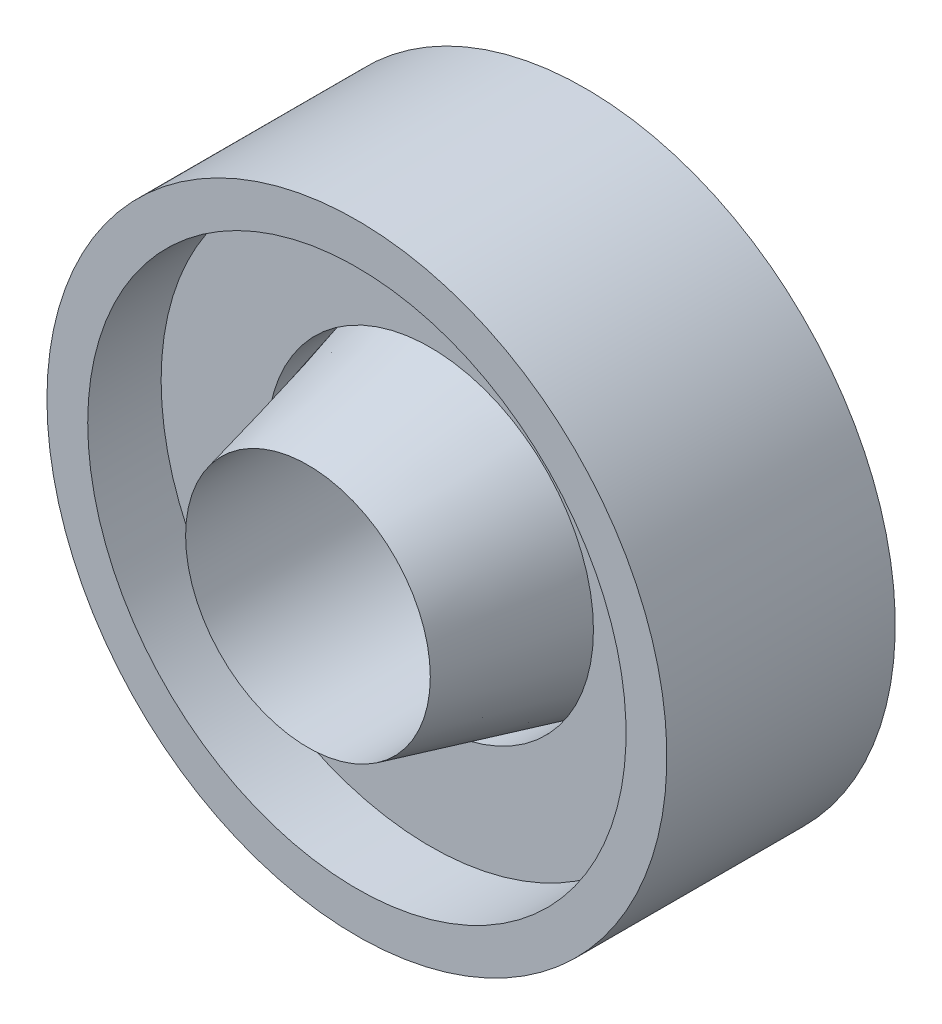
ISO-10303-21;
HEADER;
FILE_DESCRIPTION(('STEP AP214'),'2;1');
FILE_NAME('part.step','',(''),(''),'','','');
FILE_SCHEMA(('AUTOMOTIVE_DESIGN { 1 0 10303 214 1 1 1 1 }'));
ENDSEC;
DATA;
#1=APPLICATION_CONTEXT('core data for automotive mechanical design processes');
#2=APPLICATION_PROTOCOL_DEFINITION('international standard','automotive_design',2000,#1);
#3=PRODUCT_CONTEXT('',#1,'mechanical');
#4=PRODUCT('Part','Part','',(#3));
#5=PRODUCT_RELATED_PRODUCT_CATEGORY('part','',(#4));
#6=PRODUCT_DEFINITION_FORMATION('','',#4);
#7=PRODUCT_DEFINITION_CONTEXT('part definition',#1,'design');
#8=PRODUCT_DEFINITION('design','',#6,#7);
#9=PRODUCT_DEFINITION_SHAPE('','',#8);
#10=(LENGTH_UNIT() NAMED_UNIT(*) SI_UNIT(.MILLI.,.METRE.));
#11=(NAMED_UNIT(*) PLANE_ANGLE_UNIT() SI_UNIT($,.RADIAN.));
#12=(NAMED_UNIT(*) SI_UNIT($,.STERADIAN.) SOLID_ANGLE_UNIT());
#13=UNCERTAINTY_MEASURE_WITH_UNIT(LENGTH_MEASURE(1.E-05),#10,'distance_accuracy_value','');
#14=(GEOMETRIC_REPRESENTATION_CONTEXT(3) GLOBAL_UNCERTAINTY_ASSIGNED_CONTEXT((#13)) GLOBAL_UNIT_ASSIGNED_CONTEXT((#10,
#11,#12)) REPRESENTATION_CONTEXT('',''));
#15=CARTESIAN_POINT('',(0.,0.,0.));
#16=DIRECTION('',(0.,0.,1.));
#17=DIRECTION('',(1.,0.,0.));
#18=AXIS2_PLACEMENT_3D('',#15,#16,#17);
#19=CARTESIAN_POINT('',(0.,0.,4.99999999999965));
#20=DIRECTION('',(0.,0.,0.999999999999994));
#21=DIRECTION('',(0.999999999999998,0.,0.));
#22=AXIS2_PLACEMENT_3D('',#19,#20,#21);
#23=PLANE('',#22);
#24=CARTESIAN_POINT('',(0.,0.,4.99999999999965));
#25=DIRECTION('',(0.,0.,0.999999999999994));
#26=DIRECTION('',(0.999999999999998,0.,0.));
#27=AXIS2_PLACEMENT_3D('',#24,#25,#26);
#28=CIRCLE('',#27,20.);
#29=CARTESIAN_POINT('',(-20.,0.,4.99999999999965));
#30=VERTEX_POINT('',#29);
#31=EDGE_CURVE('E56',#30,#30,#28,.T.);
#32=ORIENTED_EDGE('',*,*,#31,.F.);
#33=EDGE_LOOP('',(#32));
#34=FACE_BOUND('',#33,.T.);
#35=CARTESIAN_POINT('',(0.,0.,4.99999999999965));
#36=DIRECTION('',(0.,0.,0.999999999999994));
#37=DIRECTION('',(0.999999999999998,0.,0.));
#38=AXIS2_PLACEMENT_3D('',#35,#36,#37);
#39=CIRCLE('',#38,33.);
#40=CARTESIAN_POINT('',(-33.,0.,4.99999999999965));
#41=VERTEX_POINT('',#40);
#42=EDGE_CURVE('E12',#41,#41,#39,.F.);
#43=ORIENTED_EDGE('',*,*,#42,.F.);
#44=EDGE_LOOP('',(#43));
#45=FACE_BOUND('',#44,.T.);
#46=ADVANCED_FACE('F48',(#34,#45),#23,.T.);
#47=CARTESIAN_POINT('',(0.,0.,-5.));
#48=DIRECTION('',(0.,0.,0.999999999999994));
#49=DIRECTION('',(0.999999999999998,0.,0.));
#50=AXIS2_PLACEMENT_3D('',#47,#48,#49);
#51=PLANE('',#50);
#52=CARTESIAN_POINT('',(0.,0.,-5.));
#53=DIRECTION('',(0.,0.,0.999999999999994));
#54=DIRECTION('',(0.999999999999998,0.,0.));
#55=AXIS2_PLACEMENT_3D('',#52,#53,#54);
#56=CIRCLE('',#55,20.);
#57=CARTESIAN_POINT('',(-20.,0.,-5.));
#58=VERTEX_POINT('',#57);
#59=EDGE_CURVE('E61',#58,#58,#56,.T.);
#60=ORIENTED_EDGE('',*,*,#59,.T.);
#61=EDGE_LOOP('',(#60));
#62=FACE_BOUND('',#61,.T.);
#63=CARTESIAN_POINT('',(0.,0.,-5.));
#64=DIRECTION('',(0.,0.,0.999999999999994));
#65=DIRECTION('',(0.999999999999998,0.,0.));
#66=AXIS2_PLACEMENT_3D('',#63,#64,#65);
#67=CIRCLE('',#66,33.);
#68=CARTESIAN_POINT('',(-33.,0.,-5.));
#69=VERTEX_POINT('',#68);
#70=EDGE_CURVE('E52',#69,#69,#67,.F.);
#71=ORIENTED_EDGE('',*,*,#70,.T.);
#72=EDGE_LOOP('',(#71));
#73=FACE_BOUND('',#72,.T.);
#74=ADVANCED_FACE('F50',(#62,#73),#51,.F.);
#75=CARTESIAN_POINT('',(0.,0.,4.99999999999965));
#76=DIRECTION('',(0.,0.,-0.999999999999994));
#77=DIRECTION('',(-0.999999999999998,0.,0.));
#78=AXIS2_PLACEMENT_3D('',#75,#76,#77);
#79=CYLINDRICAL_SURFACE('',#78,20.);
#80=CARTESIAN_POINT('',(-20.,0.,4.99999999999965));
#81=CARTESIAN_POINT('',(-20.,0.,4.89583333333299));
#82=CARTESIAN_POINT('',(-20.,0.,4.79166666666632));
#83=CARTESIAN_POINT('',(-20.,0.,4.583333333333));
#84=CARTESIAN_POINT('',(-20.,0.,4.47916666666634));
#85=CARTESIAN_POINT('',(-20.,0.,4.27083333333301));
#86=CARTESIAN_POINT('',(-20.,0.,4.16666666666635));
#87=CARTESIAN_POINT('',(-20.,0.,3.95833333333302));
#88=CARTESIAN_POINT('',(-20.,0.,3.85416666666636));
#89=CARTESIAN_POINT('',(-20.,0.,3.64583333333303));
#90=CARTESIAN_POINT('',(-20.,0.,3.54166666666637));
#91=CARTESIAN_POINT('',(-20.,0.,3.33333333333304));
#92=CARTESIAN_POINT('',(-20.,0.,3.22916666666638));
#93=CARTESIAN_POINT('',(-20.,0.,3.02083333333305));
#94=CARTESIAN_POINT('',(-20.,0.,2.91666666666639));
#95=CARTESIAN_POINT('',(-20.,0.,2.70833333333306));
#96=CARTESIAN_POINT('',(-20.,0.,2.6041666666664));
#97=CARTESIAN_POINT('',(-20.,0.,2.39583333333307));
#98=CARTESIAN_POINT('',(-20.,0.,2.29166666666641));
#99=CARTESIAN_POINT('',(-20.,0.,2.08333333333309));
#100=CARTESIAN_POINT('',(-20.,0.,1.97916666666642));
#101=CARTESIAN_POINT('',(-20.,0.,1.7708333333331));
#102=CARTESIAN_POINT('',(-20.,0.,1.66666666666643));
#103=CARTESIAN_POINT('',(-20.,0.,1.45833333333311));
#104=CARTESIAN_POINT('',(-20.,0.,1.35416666666644));
#105=CARTESIAN_POINT('',(-20.,0.,1.14583333333312));
#106=CARTESIAN_POINT('',(-20.,0.,1.04166666666645));
#107=CARTESIAN_POINT('',(-20.,0.,0.833333333333128));
#108=CARTESIAN_POINT('',(-20.,0.,0.729166666666464));
#109=CARTESIAN_POINT('',(-20.,0.,0.520833333333138));
#110=CARTESIAN_POINT('',(-20.,0.,0.416666666666475));
#111=CARTESIAN_POINT('',(-20.,0.,0.208333333333149));
#112=CARTESIAN_POINT('',(-20.,0.,0.104166666666486));
#113=CARTESIAN_POINT('',(-20.,0.,-0.10416666666684));
#114=CARTESIAN_POINT('',(-20.,0.,-0.208333333333503));
#115=CARTESIAN_POINT('',(-20.,0.,-0.416666666666829));
#116=CARTESIAN_POINT('',(-20.,0.,-0.520833333333492));
#117=CARTESIAN_POINT('',(-20.,0.,-0.729166666666818));
#118=CARTESIAN_POINT('',(-20.,0.,-0.833333333333481));
#119=CARTESIAN_POINT('',(-20.,0.,-1.04166666666681));
#120=CARTESIAN_POINT('',(-20.,0.,-1.14583333333347));
#121=CARTESIAN_POINT('',(-20.,0.,-1.3541666666668));
#122=CARTESIAN_POINT('',(-20.,0.,-1.45833333333346));
#123=CARTESIAN_POINT('',(-20.,0.,-1.66666666666679));
#124=CARTESIAN_POINT('',(-20.,0.,-1.77083333333345));
#125=CARTESIAN_POINT('',(-20.,0.,-1.97916666666678));
#126=CARTESIAN_POINT('',(-20.,0.,-2.08333333333344));
#127=CARTESIAN_POINT('',(-20.,0.,-2.29166666666676));
#128=CARTESIAN_POINT('',(-20.,0.,-2.39583333333343));
#129=CARTESIAN_POINT('',(-20.,0.,-2.60416666666675));
#130=CARTESIAN_POINT('',(-20.,0.,-2.70833333333342));
#131=CARTESIAN_POINT('',(-20.,0.,-2.91666666666674));
#132=CARTESIAN_POINT('',(-20.,0.,-3.02083333333341));
#133=CARTESIAN_POINT('',(-20.,0.,-3.22916666666673));
#134=CARTESIAN_POINT('',(-20.,0.,-3.3333333333334));
#135=CARTESIAN_POINT('',(-20.,0.,-3.54166666666672));
#136=CARTESIAN_POINT('',(-20.,0.,-3.64583333333338));
#137=CARTESIAN_POINT('',(-20.,0.,-3.85416666666671));
#138=CARTESIAN_POINT('',(-20.,0.,-3.95833333333337));
#139=CARTESIAN_POINT('',(-20.,0.,-4.1666666666667));
#140=CARTESIAN_POINT('',(-20.,0.,-4.27083333333336));
#141=CARTESIAN_POINT('',(-20.,0.,-4.47916666666669));
#142=CARTESIAN_POINT('',(-20.,0.,-4.58333333333335));
#143=CARTESIAN_POINT('',(-20.,0.,-4.79166666666668));
#144=CARTESIAN_POINT('',(-20.,0.,-4.89583333333334));
#145=CARTESIAN_POINT('',(-20.,0.,-5.));
#146=B_SPLINE_CURVE_WITH_KNOTS('',3,(#80,#81,#82,#83,#84,#85,#86,#87,#88,#89,#90,#91,#92,#93,
#94,#95,#96,#97,#98,#99,#100,#101,#102,#103,#104,#105,#106,#107,#108,#109,#110,#111,#112,#113,
#114,#115,#116,#117,#118,#119,#120,#121,#122,#123,#124,#125,#126,#127,#128,#129,#130,#131,#132,
#133,#134,#135,#136,#137,#138,#139,#140,#141,#142,#143,#144,#145),.UNSPECIFIED.,.F.,.F.,(4,2,2,
2,2,2,2,2,2,2,2,2,2,2,2,2,2,2,2,2,2,2,2,2,2,2,2,2,2,2,2,2,4),(0.,0.312499999999989,
0.624999999999978,0.937499999999967,1.24999999999996,1.56249999999995,1.87499999999993,
2.18749999999992,2.49999999999991,2.8124999999999,3.12499999999989,3.43749999999988,
3.74999999999987,4.06249999999986,4.37499999999985,4.68749999999984,4.99999999999983,
5.31249999999982,5.62499999999981,5.9374999999998,6.24999999999978,6.56249999999977,
6.87499999999976,7.18749999999975,7.49999999999974,7.81249999999973,8.12499999999972,
8.43749999999971,8.7499999999997,9.06249999999969,9.37499999999968,9.68749999999966,
9.99999999999966),.UNSPECIFIED.);
#147=EDGE_CURVE('BSEAM77',#30,#58,#146,.T.);
#148=ORIENTED_EDGE('',*,*,#31,.T.);
#149=ORIENTED_EDGE('',*,*,#59,.F.);
#150=ORIENTED_EDGE('',*,*,#147,.T.);
#151=ORIENTED_EDGE('',*,*,#147,.F.);
#152=EDGE_LOOP('',(#148,#150,#149,#151));
#153=FACE_BOUND('',#152,.T.);
#154=ADVANCED_FACE('F77',(#153),#79,.F.);
#155=CARTESIAN_POINT('',(0.,0.,13.9999999999997));
#156=DIRECTION('',(0.,0.,-0.999999999999994));
#157=DIRECTION('',(-0.999999999999998,0.,0.));
#158=AXIS2_PLACEMENT_3D('',#155,#156,#157);
#159=CYLINDRICAL_SURFACE('',#158,33.);
#160=CARTESIAN_POINT('',(0.,0.,13.9999999999997));
#161=DIRECTION('',(0.,0.,0.999999999999994));
#162=DIRECTION('',(0.999999999999998,0.,0.));
#163=AXIS2_PLACEMENT_3D('',#160,#161,#162);
#164=CIRCLE('',#163,33.);
#165=CARTESIAN_POINT('',(-33.,0.,13.9999999999997));
#166=VERTEX_POINT('',#165);
#167=EDGE_CURVE('E143',#166,#166,#164,.T.);
#168=CARTESIAN_POINT('',(-33.,0.,4.99999999999965));
#169=CARTESIAN_POINT('',(-33.,0.,5.09374999999965));
#170=CARTESIAN_POINT('',(-33.,0.,5.18749999999965));
#171=CARTESIAN_POINT('',(-33.,0.,5.37499999999965));
#172=CARTESIAN_POINT('',(-33.,0.,5.46874999999965));
#173=CARTESIAN_POINT('',(-33.,0.,5.65624999999965));
#174=CARTESIAN_POINT('',(-33.,0.,5.74999999999965));
#175=CARTESIAN_POINT('',(-33.,0.,5.93749999999965));
#176=CARTESIAN_POINT('',(-33.,0.,6.03124999999965));
#177=CARTESIAN_POINT('',(-33.,0.,6.21874999999965));
#178=CARTESIAN_POINT('',(-33.,0.,6.31249999999965));
#179=CARTESIAN_POINT('',(-33.,0.,6.49999999999965));
#180=CARTESIAN_POINT('',(-33.,0.,6.59374999999965));
#181=CARTESIAN_POINT('',(-33.,0.,6.78124999999965));
#182=CARTESIAN_POINT('',(-33.,0.,6.87499999999965));
#183=CARTESIAN_POINT('',(-33.,0.,7.06249999999965));
#184=CARTESIAN_POINT('',(-33.,0.,7.15624999999965));
#185=CARTESIAN_POINT('',(-33.,0.,7.34374999999965));
#186=CARTESIAN_POINT('',(-33.,0.,7.43749999999965));
#187=CARTESIAN_POINT('',(-33.,0.,7.62499999999965));
#188=CARTESIAN_POINT('',(-33.,0.,7.71874999999965));
#189=CARTESIAN_POINT('',(-33.,0.,7.90624999999965));
#190=CARTESIAN_POINT('',(-33.,0.,7.99999999999965));
#191=CARTESIAN_POINT('',(-33.,0.,8.18749999999965));
#192=CARTESIAN_POINT('',(-33.,0.,8.28124999999965));
#193=CARTESIAN_POINT('',(-33.,0.,8.46874999999965));
#194=CARTESIAN_POINT('',(-33.,0.,8.56249999999965));
#195=CARTESIAN_POINT('',(-33.,0.,8.74999999999965));
#196=CARTESIAN_POINT('',(-33.,0.,8.84374999999965));
#197=CARTESIAN_POINT('',(-33.,0.,9.03124999999965));
#198=CARTESIAN_POINT('',(-33.,0.,9.12499999999965));
#199=CARTESIAN_POINT('',(-33.,0.,9.31249999999965));
#200=CARTESIAN_POINT('',(-33.,0.,9.40624999999965));
#201=CARTESIAN_POINT('',(-33.,0.,9.59374999999965));
#202=CARTESIAN_POINT('',(-33.,0.,9.68749999999965));
#203=CARTESIAN_POINT('',(-33.,0.,9.87499999999965));
#204=CARTESIAN_POINT('',(-33.,0.,9.96874999999965));
#205=CARTESIAN_POINT('',(-33.,0.,10.1562499999997));
#206=CARTESIAN_POINT('',(-33.,0.,10.2499999999997));
#207=CARTESIAN_POINT('',(-33.,0.,10.4374999999997));
#208=CARTESIAN_POINT('',(-33.,0.,10.5312499999997));
#209=CARTESIAN_POINT('',(-33.,0.,10.7187499999997));
#210=CARTESIAN_POINT('',(-33.,0.,10.8124999999997));
#211=CARTESIAN_POINT('',(-33.,0.,10.9999999999997));
#212=CARTESIAN_POINT('',(-33.,0.,11.0937499999997));
#213=CARTESIAN_POINT('',(-33.,0.,11.2812499999997));
#214=CARTESIAN_POINT('',(-33.,0.,11.3749999999997));
#215=CARTESIAN_POINT('',(-33.,0.,11.5624999999997));
#216=CARTESIAN_POINT('',(-33.,0.,11.6562499999997));
#217=CARTESIAN_POINT('',(-33.,0.,11.8437499999997));
#218=CARTESIAN_POINT('',(-33.,0.,11.9374999999997));
#219=CARTESIAN_POINT('',(-33.,0.,12.1249999999997));
#220=CARTESIAN_POINT('',(-33.,0.,12.2187499999997));
#221=CARTESIAN_POINT('',(-33.,0.,12.4062499999997));
#222=CARTESIAN_POINT('',(-33.,0.,12.4999999999997));
#223=CARTESIAN_POINT('',(-33.,0.,12.6874999999997));
#224=CARTESIAN_POINT('',(-33.,0.,12.7812499999997));
#225=CARTESIAN_POINT('',(-33.,0.,12.9687499999997));
#226=CARTESIAN_POINT('',(-33.,0.,13.0624999999997));
#227=CARTESIAN_POINT('',(-33.,0.,13.2499999999997));
#228=CARTESIAN_POINT('',(-33.,0.,13.3437499999997));
#229=CARTESIAN_POINT('',(-33.,0.,13.5312499999997));
#230=CARTESIAN_POINT('',(-33.,0.,13.6249999999997));
#231=CARTESIAN_POINT('',(-33.,0.,13.8124999999997));
#232=CARTESIAN_POINT('',(-33.,0.,13.9062499999997));
#233=CARTESIAN_POINT('',(-33.,0.,13.9999999999997));
#234=B_SPLINE_CURVE_WITH_KNOTS('',3,(#168,#169,#170,#171,#172,#173,#174,#175,#176,#177,#178,
#179,#180,#181,#182,#183,#184,#185,#186,#187,#188,#189,#190,#191,#192,#193,#194,#195,#196,#197,
#198,#199,#200,#201,#202,#203,#204,#205,#206,#207,#208,#209,#210,#211,#212,#213,#214,#215,#216,
#217,#218,#219,#220,#221,#222,#223,#224,#225,#226,#227,#228,#229,#230,#231,#232,#233),
.UNSPECIFIED.,.F.,.F.,(4,2,2,2,2,2,2,2,2,2,2,2,2,2,2,2,2,2,2,2,2,2,2,2,2,2,2,2,2,2,2,2,4),(0.,
0.28125,0.5625,0.843749999999999,1.125,1.40625,1.6875,1.96875,2.25,2.53125,2.8125,3.09375,3.375,
3.65625,3.9375,4.21875,4.5,4.78125,5.0625,5.34375,5.625,5.90625,6.1875,6.46875,6.75,7.03125,
7.3125,7.59375,7.875,8.15625,8.4375,8.71875,9.),.UNSPECIFIED.);
#235=EDGE_CURVE('BSEAM79',#41,#166,#234,.T.);
#236=ORIENTED_EDGE('',*,*,#42,.T.);
#237=ORIENTED_EDGE('',*,*,#167,.T.);
#238=ORIENTED_EDGE('',*,*,#235,.T.);
#239=ORIENTED_EDGE('',*,*,#235,.F.);
#240=EDGE_LOOP('',(#236,#238,#237,#239));
#241=FACE_BOUND('',#240,.T.);
#242=ADVANCED_FACE('F79',(#241),#159,.F.);
#243=CARTESIAN_POINT('',(0.,0.,-14.));
#244=DIRECTION('',(0.,0.,0.999999999999994));
#245=DIRECTION('',(0.999999999999998,0.,0.));
#246=AXIS2_PLACEMENT_3D('',#243,#244,#245);
#247=PLANE('',#246);
#248=CARTESIAN_POINT('',(0.,0.,-14.));
#249=DIRECTION('',(0.,0.,0.999999999999994));
#250=DIRECTION('',(0.999999999999998,0.,0.));
#251=AXIS2_PLACEMENT_3D('',#248,#249,#250);
#252=CIRCLE('',#251,38.);
#253=CARTESIAN_POINT('',(-37.9999999999999,0.,-14.));
#254=VERTEX_POINT('',#253);
#255=EDGE_CURVE('E70',#254,#254,#252,.T.);
#256=ORIENTED_EDGE('',*,*,#255,.F.);
#257=EDGE_LOOP('',(#256));
#258=FACE_BOUND('',#257,.T.);
#259=CARTESIAN_POINT('',(0.,0.,-14.));
#260=DIRECTION('',(0.,0.,0.999999999999994));
#261=DIRECTION('',(0.999999999999998,0.,0.));
#262=AXIS2_PLACEMENT_3D('',#259,#260,#261);
#263=CIRCLE('',#262,33.);
#264=CARTESIAN_POINT('',(-33.,0.,-14.));
#265=VERTEX_POINT('',#264);
#266=EDGE_CURVE('E65',#265,#265,#263,.T.);
#267=ORIENTED_EDGE('',*,*,#266,.T.);
#268=EDGE_LOOP('',(#267));
#269=FACE_BOUND('',#268,.T.);
#270=ADVANCED_FACE('F86',(#258,#269),#247,.F.);
#271=CARTESIAN_POINT('',(0.,0.,13.9999999999997));
#272=DIRECTION('',(0.,0.,-0.999999999999994));
#273=DIRECTION('',(-0.999999999999998,0.,0.));
#274=AXIS2_PLACEMENT_3D('',#271,#272,#273);
#275=CYLINDRICAL_SURFACE('',#274,38.);
#276=CARTESIAN_POINT('',(0.,0.,13.9999999999997));
#277=DIRECTION('',(0.,0.,0.999999999999994));
#278=DIRECTION('',(0.999999999999998,0.,0.));
#279=AXIS2_PLACEMENT_3D('',#276,#277,#278);
#280=CIRCLE('',#279,38.);
#281=CARTESIAN_POINT('',(-37.9999999999999,0.,13.9999999999997));
#282=VERTEX_POINT('',#281);
#283=EDGE_CURVE('E67',#282,#282,#280,.T.);
#284=CARTESIAN_POINT('',(-37.9999999999999,0.,13.9999999999997));
#285=CARTESIAN_POINT('',(-37.9999999999999,0.,13.708333333333));
#286=CARTESIAN_POINT('',(-37.9999999999999,0.,13.4166666666663));
#287=CARTESIAN_POINT('',(-37.9999999999999,0.,12.833333333333));
#288=CARTESIAN_POINT('',(-37.9999999999999,0.,12.5416666666663));
#289=CARTESIAN_POINT('',(-37.9999999999999,0.,11.958333333333));
#290=CARTESIAN_POINT('',(-37.9999999999999,0.,11.6666666666663));
#291=CARTESIAN_POINT('',(-37.9999999999999,0.,11.083333333333));
#292=CARTESIAN_POINT('',(-37.9999999999999,0.,10.7916666666664));
#293=CARTESIAN_POINT('',(-37.9999999999999,0.,10.208333333333));
#294=CARTESIAN_POINT('',(-37.9999999999999,0.,9.91666666666637));
#295=CARTESIAN_POINT('',(-37.9999999999999,0.,9.33333333333304));
#296=CARTESIAN_POINT('',(-37.9999999999999,0.,9.04166666666638));
#297=CARTESIAN_POINT('',(-37.9999999999999,0.,8.45833333333306));
#298=CARTESIAN_POINT('',(-37.9999999999999,0.,8.16666666666639));
#299=CARTESIAN_POINT('',(-37.9999999999999,0.,7.58333333333307));
#300=CARTESIAN_POINT('',(-37.9999999999999,0.,7.2916666666664));
#301=CARTESIAN_POINT('',(-37.9999999999999,0.,6.70833333333308));
#302=CARTESIAN_POINT('',(-37.9999999999999,0.,6.41666666666642));
#303=CARTESIAN_POINT('',(-37.9999999999999,0.,5.83333333333309));
#304=CARTESIAN_POINT('',(-37.9999999999999,0.,5.54166666666643));
#305=CARTESIAN_POINT('',(-37.9999999999999,0.,4.9583333333331));
#306=CARTESIAN_POINT('',(-37.9999999999999,0.,4.66666666666644));
#307=CARTESIAN_POINT('',(-37.9999999999999,0.,4.08333333333311));
#308=CARTESIAN_POINT('',(-37.9999999999999,0.,3.79166666666645));
#309=CARTESIAN_POINT('',(-37.9999999999999,0.,3.20833333333312));
#310=CARTESIAN_POINT('',(-37.9999999999999,0.,2.91666666666646));
#311=CARTESIAN_POINT('',(-37.9999999999999,0.,2.33333333333313));
#312=CARTESIAN_POINT('',(-37.9999999999999,0.,2.04166666666647));
#313=CARTESIAN_POINT('',(-37.9999999999999,0.,1.45833333333314));
#314=CARTESIAN_POINT('',(-37.9999999999999,0.,1.16666666666648));
#315=CARTESIAN_POINT('',(-37.9999999999999,0.,0.583333333333156));
#316=CARTESIAN_POINT('',(-37.9999999999999,0.,0.291666666666493));
#317=CARTESIAN_POINT('',(-37.9999999999999,0.,-0.291666666666833));
#318=CARTESIAN_POINT('',(-37.9999999999999,0.,-0.583333333333496));
#319=CARTESIAN_POINT('',(-37.9999999999999,0.,-1.16666666666682));
#320=CARTESIAN_POINT('',(-37.9999999999999,0.,-1.45833333333349));
#321=CARTESIAN_POINT('',(-37.9999999999999,0.,-2.04166666666681));
#322=CARTESIAN_POINT('',(-37.9999999999999,0.,-2.33333333333348));
#323=CARTESIAN_POINT('',(-37.9999999999999,0.,-2.9166666666668));
#324=CARTESIAN_POINT('',(-37.9999999999999,0.,-3.20833333333346));
#325=CARTESIAN_POINT('',(-37.9999999999999,0.,-3.79166666666679));
#326=CARTESIAN_POINT('',(-37.9999999999999,0.,-4.08333333333346));
#327=CARTESIAN_POINT('',(-37.9999999999999,0.,-4.66666666666678));
#328=CARTESIAN_POINT('',(-37.9999999999999,0.,-4.95833333333344));
#329=CARTESIAN_POINT('',(-37.9999999999999,0.,-5.54166666666677));
#330=CARTESIAN_POINT('',(-37.9999999999999,0.,-5.83333333333343));
#331=CARTESIAN_POINT('',(-37.9999999999999,0.,-6.41666666666676));
#332=CARTESIAN_POINT('',(-37.9999999999999,0.,-6.70833333333342));
#333=CARTESIAN_POINT('',(-37.9999999999999,0.,-7.29166666666675));
#334=CARTESIAN_POINT('',(-37.9999999999999,0.,-7.58333333333341));
#335=CARTESIAN_POINT('',(-37.9999999999999,0.,-8.16666666666674));
#336=CARTESIAN_POINT('',(-37.9999999999999,0.,-8.4583333333334));
#337=CARTESIAN_POINT('',(-37.9999999999999,0.,-9.04166666666672));
#338=CARTESIAN_POINT('',(-37.9999999999999,0.,-9.33333333333339));
#339=CARTESIAN_POINT('',(-37.9999999999999,0.,-9.91666666666671));
#340=CARTESIAN_POINT('',(-37.9999999999999,0.,-10.2083333333334));
#341=CARTESIAN_POINT('',(-37.9999999999999,0.,-10.7916666666667));
#342=CARTESIAN_POINT('',(-37.9999999999999,0.,-11.0833333333334));
#343=CARTESIAN_POINT('',(-37.9999999999999,0.,-11.6666666666667));
#344=CARTESIAN_POINT('',(-37.9999999999999,0.,-11.9583333333334));
#345=CARTESIAN_POINT('',(-37.9999999999999,0.,-12.5416666666667));
#346=CARTESIAN_POINT('',(-37.9999999999999,0.,-12.8333333333333));
#347=CARTESIAN_POINT('',(-37.9999999999999,0.,-13.4166666666667));
#348=CARTESIAN_POINT('',(-37.9999999999999,0.,-13.7083333333333));
#349=CARTESIAN_POINT('',(-37.9999999999999,0.,-14.));
#350=B_SPLINE_CURVE_WITH_KNOTS('',3,(#284,#285,#286,#287,#288,#289,#290,#291,#292,#293,#294,
#295,#296,#297,#298,#299,#300,#301,#302,#303,#304,#305,#306,#307,#308,#309,#310,#311,#312,#313,
#314,#315,#316,#317,#318,#319,#320,#321,#322,#323,#324,#325,#326,#327,#328,#329,#330,#331,#332,
#333,#334,#335,#336,#337,#338,#339,#340,#341,#342,#343,#344,#345,#346,#347,#348,#349),
.UNSPECIFIED.,.F.,.F.,(4,2,2,2,2,2,2,2,2,2,2,2,2,2,2,2,2,2,2,2,2,2,2,2,2,2,2,2,2,2,2,2,4),(0.,
0.87499999999999,1.74999999999998,2.62499999999997,3.49999999999996,4.37499999999995,
5.24999999999993,6.12499999999992,6.99999999999991,7.8749999999999,8.74999999999989,
9.62499999999988,10.4999999999999,11.3749999999999,12.2499999999998,13.1249999999998,
13.9999999999998,14.8749999999998,15.7499999999998,16.6249999999998,17.4999999999998,
18.3749999999998,19.2499999999998,20.1249999999998,20.9999999999997,21.8749999999997,
22.7499999999997,23.6249999999997,24.4999999999997,25.3749999999997,26.2499999999997,
27.1249999999997,27.9999999999997),.UNSPECIFIED.);
#351=EDGE_CURVE('BSEAM104',#282,#254,#350,.T.);
#352=ORIENTED_EDGE('',*,*,#283,.F.);
#353=ORIENTED_EDGE('',*,*,#255,.T.);
#354=ORIENTED_EDGE('',*,*,#351,.T.);
#355=ORIENTED_EDGE('',*,*,#351,.F.);
#356=EDGE_LOOP('',(#352,#354,#353,#355));
#357=FACE_BOUND('',#356,.T.);
#358=ADVANCED_FACE('F104',(#357),#275,.T.);
#359=CARTESIAN_POINT('',(0.,0.,13.9999999999997));
#360=DIRECTION('',(0.,0.,0.999999999999994));
#361=DIRECTION('',(0.999999999999998,0.,0.));
#362=AXIS2_PLACEMENT_3D('',#359,#360,#361);
#363=PLANE('',#362);
#364=ORIENTED_EDGE('',*,*,#283,.T.);
#365=EDGE_LOOP('',(#364));
#366=FACE_BOUND('',#365,.T.);
#367=ORIENTED_EDGE('',*,*,#167,.F.);
#368=EDGE_LOOP('',(#367));
#369=FACE_BOUND('',#368,.T.);
#370=ADVANCED_FACE('F109',(#366,#369),#363,.T.);
#371=CARTESIAN_POINT('',(-33.,0.,-14.));
#372=CARTESIAN_POINT('',(-33.,0.,-13.90625));
#373=CARTESIAN_POINT('',(-33.,0.,-13.8125));
#374=CARTESIAN_POINT('',(-33.,0.,-13.625));
#375=CARTESIAN_POINT('',(-33.,0.,-13.53125));
#376=CARTESIAN_POINT('',(-33.,0.,-13.34375));
#377=CARTESIAN_POINT('',(-33.,0.,-13.25));
#378=CARTESIAN_POINT('',(-33.,0.,-13.0625));
#379=CARTESIAN_POINT('',(-33.,0.,-12.96875));
#380=CARTESIAN_POINT('',(-33.,0.,-12.78125));
#381=CARTESIAN_POINT('',(-33.,0.,-12.6875));
#382=CARTESIAN_POINT('',(-33.,0.,-12.5));
#383=CARTESIAN_POINT('',(-33.,0.,-12.40625));
#384=CARTESIAN_POINT('',(-33.,0.,-12.21875));
#385=CARTESIAN_POINT('',(-33.,0.,-12.125));
#386=CARTESIAN_POINT('',(-33.,0.,-11.9375));
#387=CARTESIAN_POINT('',(-33.,0.,-11.84375));
#388=CARTESIAN_POINT('',(-33.,0.,-11.65625));
#389=CARTESIAN_POINT('',(-33.,0.,-11.5625));
#390=CARTESIAN_POINT('',(-33.,0.,-11.375));
#391=CARTESIAN_POINT('',(-33.,0.,-11.28125));
#392=CARTESIAN_POINT('',(-33.,0.,-11.09375));
#393=CARTESIAN_POINT('',(-33.,0.,-11.));
#394=CARTESIAN_POINT('',(-33.,0.,-10.8125));
#395=CARTESIAN_POINT('',(-33.,0.,-10.71875));
#396=CARTESIAN_POINT('',(-33.,0.,-10.53125));
#397=CARTESIAN_POINT('',(-33.,0.,-10.4375));
#398=CARTESIAN_POINT('',(-33.,0.,-10.25));
#399=CARTESIAN_POINT('',(-33.,0.,-10.15625));
#400=CARTESIAN_POINT('',(-33.,0.,-9.96875));
#401=CARTESIAN_POINT('',(-33.,0.,-9.875));
#402=CARTESIAN_POINT('',(-33.,0.,-9.6875));
#403=CARTESIAN_POINT('',(-33.,0.,-9.59375));
#404=CARTESIAN_POINT('',(-33.,0.,-9.40625));
#405=CARTESIAN_POINT('',(-33.,0.,-9.3125));
#406=CARTESIAN_POINT('',(-33.,0.,-9.125));
#407=CARTESIAN_POINT('',(-33.,0.,-9.03125));
#408=CARTESIAN_POINT('',(-33.,0.,-8.84375));
#409=CARTESIAN_POINT('',(-33.,0.,-8.75));
#410=CARTESIAN_POINT('',(-33.,0.,-8.5625));
#411=CARTESIAN_POINT('',(-33.,0.,-8.46875));
#412=CARTESIAN_POINT('',(-33.,0.,-8.28125));
#413=CARTESIAN_POINT('',(-33.,0.,-8.1875));
#414=CARTESIAN_POINT('',(-33.,0.,-8.));
#415=CARTESIAN_POINT('',(-33.,0.,-7.90625));
#416=CARTESIAN_POINT('',(-33.,0.,-7.71875));
#417=CARTESIAN_POINT('',(-33.,0.,-7.625));
#418=CARTESIAN_POINT('',(-33.,0.,-7.4375));
#419=CARTESIAN_POINT('',(-33.,0.,-7.34375));
#420=CARTESIAN_POINT('',(-33.,0.,-7.15625));
#421=CARTESIAN_POINT('',(-33.,0.,-7.0625));
#422=CARTESIAN_POINT('',(-33.,0.,-6.875));
#423=CARTESIAN_POINT('',(-33.,0.,-6.78125));
#424=CARTESIAN_POINT('',(-33.,0.,-6.59375));
#425=CARTESIAN_POINT('',(-33.,0.,-6.5));
#426=CARTESIAN_POINT('',(-33.,0.,-6.3125));
#427=CARTESIAN_POINT('',(-33.,0.,-6.21875));
#428=CARTESIAN_POINT('',(-33.,0.,-6.03125));
#429=CARTESIAN_POINT('',(-33.,0.,-5.9375));
#430=CARTESIAN_POINT('',(-33.,0.,-5.75));
#431=CARTESIAN_POINT('',(-33.,0.,-5.65625));
#432=CARTESIAN_POINT('',(-33.,0.,-5.46875));
#433=CARTESIAN_POINT('',(-33.,0.,-5.375));
#434=CARTESIAN_POINT('',(-33.,0.,-5.1875));
#435=CARTESIAN_POINT('',(-33.,0.,-5.09375));
#436=CARTESIAN_POINT('',(-33.,0.,-5.));
#437=B_SPLINE_CURVE_WITH_KNOTS('',3,(#371,#372,#373,#374,#375,#376,#377,#378,#379,#380,#381,
#382,#383,#384,#385,#386,#387,#388,#389,#390,#391,#392,#393,#394,#395,#396,#397,#398,#399,#400,
#401,#402,#403,#404,#405,#406,#407,#408,#409,#410,#411,#412,#413,#414,#415,#416,#417,#418,#419,
#420,#421,#422,#423,#424,#425,#426,#427,#428,#429,#430,#431,#432,#433,#434,#435,#436),
.UNSPECIFIED.,.F.,.F.,(4,2,2,2,2,2,2,2,2,2,2,2,2,2,2,2,2,2,2,2,2,2,2,2,2,2,2,2,2,2,2,2,4),(0.,
0.281249999999997,0.5625,0.843749999999997,1.125,1.40625,1.6875,1.96875,2.25,2.53125,2.8125,
3.09375,3.375,3.65625,3.93749999999999,4.21875,4.5,4.78124999999999,5.0625,5.34374999999999,
5.62499999999999,5.90624999999999,6.18749999999999,6.46874999999999,6.75,7.03125,
7.31249999999999,7.59375,7.87499999999999,8.15624999999999,8.43749999999999,8.71874999999999,
8.99999999999999),.UNSPECIFIED.);
#438=EDGE_CURVE('BSEAM88',#265,#69,#437,.T.);
#439=ORIENTED_EDGE('',*,*,#266,.F.);
#440=ORIENTED_EDGE('',*,*,#70,.F.);
#441=ORIENTED_EDGE('',*,*,#438,.T.);
#442=ORIENTED_EDGE('',*,*,#438,.F.);
#443=EDGE_LOOP('',(#439,#441,#440,#442));
#444=FACE_BOUND('',#443,.T.);
#445=ADVANCED_FACE('F88',(#444),#159,.F.);
#446=CLOSED_SHELL('',(#46,#74,#154,#242,#270,#358,#370,#445));
#447=MANIFOLD_SOLID_BREP('B2',#446);
#448=CARTESIAN_POINT('',(0.,0.,19.9999999999996));
#449=DIRECTION('',(0.,0.,-0.999999999999994));
#450=DIRECTION('',(-0.999999999999998,0.,0.));
#451=AXIS2_PLACEMENT_3D('',#448,#449,#450);
#452=CONICAL_SURFACE('',#451,15.,0.244978663126864);
#453=CARTESIAN_POINT('',(0.,0.,19.9999999999996));
#454=DIRECTION('',(0.,0.,0.999999999999994));
#455=DIRECTION('',(0.999999999999998,0.,0.));
#456=AXIS2_PLACEMENT_3D('',#453,#454,#455);
#457=CIRCLE('',#456,15.);
#458=CARTESIAN_POINT('',(-15.,0.,19.9999999999996));
#459=VERTEX_POINT('',#458);
#460=EDGE_CURVE('E164',#459,#459,#457,.T.);
#461=CARTESIAN_POINT('',(0.,0.,0.));
#462=DIRECTION('',(0.,0.,0.999999999999994));
#463=DIRECTION('',(0.999999999999998,0.,0.));
#464=AXIS2_PLACEMENT_3D('',#461,#462,#463);
#465=CIRCLE('',#464,20.);
#466=CARTESIAN_POINT('',(-19.9999999999999,0.,0.));
#467=VERTEX_POINT('',#466);
#468=EDGE_CURVE('E47',#467,#467,#465,.F.);
#469=CARTESIAN_POINT('',(-15.,0.,19.9999999999996));
#470=CARTESIAN_POINT('',(-15.0520833333333,0.,19.7916666666663));
#471=CARTESIAN_POINT('',(-15.1041666666667,0.,19.583333333333));
#472=CARTESIAN_POINT('',(-15.2083333333333,0.,19.1666666666663));
#473=CARTESIAN_POINT('',(-15.2604166666666,0.,18.958333333333));
#474=CARTESIAN_POINT('',(-15.3645833333333,0.,18.5416666666663));
#475=CARTESIAN_POINT('',(-15.4166666666666,0.,18.333333333333));
#476=CARTESIAN_POINT('',(-15.5208333333333,0.,17.9166666666663));
#477=CARTESIAN_POINT('',(-15.5729166666666,0.,17.708333333333));
#478=CARTESIAN_POINT('',(-15.6770833333333,0.,17.2916666666664));
#479=CARTESIAN_POINT('',(-15.7291666666666,0.,17.083333333333));
#480=CARTESIAN_POINT('',(-15.8333333333333,0.,16.6666666666664));
#481=CARTESIAN_POINT('',(-15.8854166666666,0.,16.458333333333));
#482=CARTESIAN_POINT('',(-15.9895833333333,0.,16.0416666666664));
#483=CARTESIAN_POINT('',(-16.0416666666666,0.,15.833333333333));
#484=CARTESIAN_POINT('',(-16.1458333333333,0.,15.4166666666664));
#485=CARTESIAN_POINT('',(-16.1979166666666,0.,15.2083333333331));
#486=CARTESIAN_POINT('',(-16.3020833333333,0.,14.7916666666664));
#487=CARTESIAN_POINT('',(-16.3541666666666,0.,14.5833333333331));
#488=CARTESIAN_POINT('',(-16.4583333333333,0.,14.1666666666664));
#489=CARTESIAN_POINT('',(-16.5104166666666,0.,13.9583333333331));
#490=CARTESIAN_POINT('',(-16.6145833333333,0.,13.5416666666664));
#491=CARTESIAN_POINT('',(-16.6666666666666,0.,13.3333333333331));
#492=CARTESIAN_POINT('',(-16.7708333333333,0.,12.9166666666664));
#493=CARTESIAN_POINT('',(-16.8229166666666,0.,12.7083333333331));
#494=CARTESIAN_POINT('',(-16.9270833333333,0.,12.2916666666664));
#495=CARTESIAN_POINT('',(-16.9791666666666,0.,12.0833333333331));
#496=CARTESIAN_POINT('',(-17.0833333333333,0.,11.6666666666665));
#497=CARTESIAN_POINT('',(-17.1354166666666,0.,11.4583333333331));
#498=CARTESIAN_POINT('',(-17.2395833333333,0.,11.0416666666665));
#499=CARTESIAN_POINT('',(-17.2916666666666,0.,10.8333333333331));
#500=CARTESIAN_POINT('',(-17.3958333333333,0.,10.4166666666665));
#501=CARTESIAN_POINT('',(-17.4479166666666,0.,10.2083333333332));
#502=CARTESIAN_POINT('',(-17.5520833333333,0.,9.79166666666649));
#503=CARTESIAN_POINT('',(-17.6041666666666,0.,9.58333333333316));
#504=CARTESIAN_POINT('',(-17.7083333333333,0.,9.1666666666665));
#505=CARTESIAN_POINT('',(-17.7604166666666,0.,8.95833333333317));
#506=CARTESIAN_POINT('',(-17.8645833333333,0.,8.54166666666651));
#507=CARTESIAN_POINT('',(-17.9166666666666,0.,8.33333333333318));
#508=CARTESIAN_POINT('',(-18.0208333333333,0.,7.91666666666652));
#509=CARTESIAN_POINT('',(-18.0729166666666,0.,7.7083333333332));
#510=CARTESIAN_POINT('',(-18.1770833333333,0.,7.29166666666654));
#511=CARTESIAN_POINT('',(-18.2291666666666,0.,7.08333333333321));
#512=CARTESIAN_POINT('',(-18.3333333333333,0.,6.66666666666655));
#513=CARTESIAN_POINT('',(-18.3854166666666,0.,6.45833333333322));
#514=CARTESIAN_POINT('',(-18.4895833333333,0.,6.04166666666656));
#515=CARTESIAN_POINT('',(-18.5416666666666,0.,5.83333333333323));
#516=CARTESIAN_POINT('',(-18.6458333333333,0.,5.41666666666657));
#517=CARTESIAN_POINT('',(-18.6979166666666,0.,5.20833333333324));
#518=CARTESIAN_POINT('',(-18.8020833333333,0.,4.79166666666658));
#519=CARTESIAN_POINT('',(-18.8541666666666,0.,4.58333333333325));
#520=CARTESIAN_POINT('',(-18.9583333333333,0.,4.16666666666659));
#521=CARTESIAN_POINT('',(-19.0104166666666,0.,3.95833333333326));
#522=CARTESIAN_POINT('',(-19.1145833333333,0.,3.5416666666666));
#523=CARTESIAN_POINT('',(-19.1666666666666,0.,3.33333333333327));
#524=CARTESIAN_POINT('',(-19.2708333333333,0.,2.91666666666661));
#525=CARTESIAN_POINT('',(-19.3229166666666,0.,2.70833333333329));
#526=CARTESIAN_POINT('',(-19.4270833333333,0.,2.29166666666663));
#527=CARTESIAN_POINT('',(-19.4791666666666,0.,2.0833333333333));
#528=CARTESIAN_POINT('',(-19.5833333333333,0.,1.66666666666664));
#529=CARTESIAN_POINT('',(-19.6354166666666,0.,1.45833333333331));
#530=CARTESIAN_POINT('',(-19.7395833333333,0.,1.04166666666665));
#531=CARTESIAN_POINT('',(-19.7916666666666,0.,0.833333333333319));
#532=CARTESIAN_POINT('',(-19.8958333333333,0.,0.416666666666661));
#533=CARTESIAN_POINT('',(-19.9479166666666,0.,0.208333333333331));
#534=CARTESIAN_POINT('',(-19.9999999999999,0.,0.));
#535=B_SPLINE_CURVE_WITH_KNOTS('',3,(#469,#470,#471,#472,#473,#474,#475,#476,#477,#478,#479,
#480,#481,#482,#483,#484,#485,#486,#487,#488,#489,#490,#491,#492,#493,#494,#495,#496,#497,#498,
#499,#500,#501,#502,#503,#504,#505,#506,#507,#508,#509,#510,#511,#512,#513,#514,#515,#516,#517,
#518,#519,#520,#521,#522,#523,#524,#525,#526,#527,#528,#529,#530,#531,#532,#533,#534),
.UNSPECIFIED.,.F.,.F.,(4,2,2,2,2,2,2,2,2,2,2,2,2,2,2,2,2,2,2,2,2,2,2,2,2,2,2,2,2,2,2,2,4),(0.,
0.644235254002749,1.2884705080055,1.93270576200825,2.57694101601099,3.22117627001374,
3.86541152401649,4.50964677801924,5.15388203202199,5.79811728602474,6.44235254002748,
7.08658779403023,7.73082304803298,8.37505830203573,9.01929355603848,9.66352881004123,
10.307764064044,10.9519993180467,11.5962345720495,12.2404698260522,12.884705080055,
13.5289403340577,14.1731755880605,14.8174108420632,15.461646096066,16.1058813500687,
16.7501166040715,17.3943518580742,18.0385871120769,18.6828223660797,19.3270576200824,
19.9712928740852,20.6155281280879),.UNSPECIFIED.);
#536=EDGE_CURVE('BSEAM158',#459,#467,#535,.T.);
#537=ORIENTED_EDGE('',*,*,#460,.F.);
#538=ORIENTED_EDGE('',*,*,#468,.F.);
#539=ORIENTED_EDGE('',*,*,#536,.T.);
#540=ORIENTED_EDGE('',*,*,#536,.F.);
#541=EDGE_LOOP('',(#537,#539,#538,#540));
#542=FACE_BOUND('',#541,.T.);
#543=ADVANCED_FACE('F158',(#542),#452,.T.);
#544=CARTESIAN_POINT('',(4.90332044482415,14.1759461276971,-20.));
#545=CARTESIAN_POINT('',(1.05508513201259,19.9721504942307,0.));
#546=CARTESIAN_POINT('',(-23.44857181057,23.9825870173448,-20.0000000000003));
#547=CARTESIAN_POINT('',(-38.8892158564493,22.0823207582554,-2.60208521396521E-13));
#548=CARTESIAN_POINT('',(-33.2552127002181,-4.36930523804912,-20.));
#549=CARTESIAN_POINT('',(-40.9993861204743,-17.8619802302058,-5.20417042793042E-13));
#550=CARTESIAN_POINT('',(-4.9033204448241,-14.1759461276971,-20.));
#551=CARTESIAN_POINT('',(-1.05508513201254,-19.9721504942308,0.));
#552=CARTESIAN_POINT('',(23.44857181057,-23.9825870173453,-20.0000000000005));
#553=CARTESIAN_POINT('',(38.889215856449,-22.0823207582561,-2.60208521396521E-13));
#554=CARTESIAN_POINT('',(33.2552127002183,4.36930523804879,-20.0000000000003));
#555=CARTESIAN_POINT('',(40.999386120474,17.8619802302057,-2.60208521396521E-13));
#556=CARTESIAN_POINT('',(4.90332044482415,14.1759461276971,-20.));
#557=CARTESIAN_POINT('',(1.05508513201259,19.9721504942307,0.));
#558=(BOUNDED_SURFACE() B_SPLINE_SURFACE(3,1,((#544,#545),(#546,#547),(#548,#549),(#550,#551),
(#552,#553),(#554,#555),(#556,#557)),.UNSPECIFIED.,.T.,.F.,.F.) B_SPLINE_SURFACE_WITH_KNOTS((4,
3,4),(2,2),(0.,0.5,1.),(0.,1.),
.UNSPECIFIED.) GEOMETRIC_REPRESENTATION_ITEM() RATIONAL_B_SPLINE_SURFACE(((1.,1.),
(0.333333333333333,0.333333333333333),(0.333333333333333,0.333333333333333),(1.,1.),
(0.333333333333333,0.333333333333333),(0.333333333333333,0.333333333333333),(1.,1.))) REPRESENTATION_ITEM('') SURFACE());
#559=CARTESIAN_POINT('',(0.,0.,-20.));
#560=DIRECTION('',(0.,0.,0.999999999999994));
#561=DIRECTION('',(0.999999999999998,0.,0.));
#562=AXIS2_PLACEMENT_3D('',#559,#560,#561);
#563=CIRCLE('',#562,15.);
#564=CARTESIAN_POINT('',(15.,0.,-20.));
#565=VERTEX_POINT('',#564);
#566=EDGE_CURVE('E168',#565,#565,#563,.T.);
#567=ORIENTED_EDGE('',*,*,#566,.T.);
#568=EDGE_LOOP('',(#567));
#569=FACE_BOUND('',#568,.T.);
#570=ORIENTED_EDGE('',*,*,#468,.T.);
#571=EDGE_LOOP('',(#570));
#572=FACE_BOUND('',#571,.T.);
#573=ADVANCED_FACE('F175',(#569,#572),#558,.T.);
#574=CARTESIAN_POINT('',(0.,0.,-30.));
#575=DIRECTION('',(0.,0.,0.999999999999994));
#576=DIRECTION('',(0.999999999999998,0.,0.));
#577=AXIS2_PLACEMENT_3D('',#574,#575,#576);
#578=CYLINDRICAL_SURFACE('',#577,15.);
#579=ORIENTED_EDGE('',*,*,#460,.T.);
#580=EDGE_LOOP('',(#579));
#581=FACE_BOUND('',#580,.T.);
#582=ORIENTED_EDGE('',*,*,#566,.F.);
#583=EDGE_LOOP('',(#582));
#584=FACE_BOUND('',#583,.T.);
#585=ADVANCED_FACE('F177',(#581,#584),#578,.F.);
#586=CLOSED_SHELL('',(#543,#573,#585));
#587=MANIFOLD_SOLID_BREP('B7',#586);
#588=ADVANCED_BREP_SHAPE_REPRESENTATION('',(#18,#447,#587),#14);
#589=SHAPE_DEFINITION_REPRESENTATION(#9,#588);
ENDSEC;
END-ISO-10303-21;
